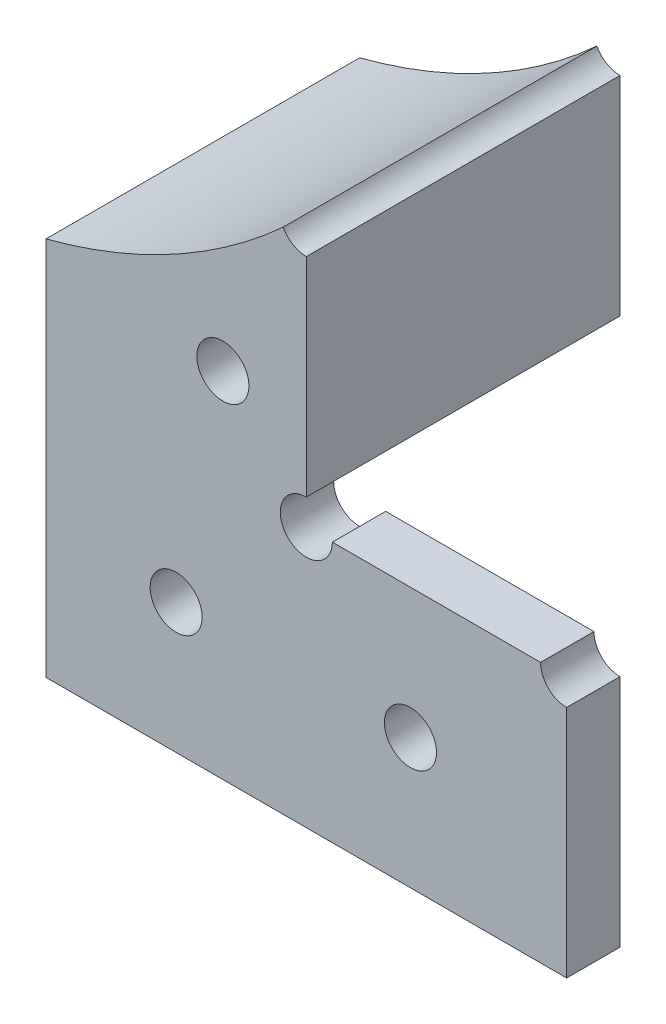
ISO-10303-21;
HEADER;
FILE_DESCRIPTION(('STEP AP214'),'2;1');
FILE_NAME('part.step','',(''),(''),'','','');
FILE_SCHEMA(('AUTOMOTIVE_DESIGN { 1 0 10303 214 1 1 1 1 }'));
ENDSEC;
DATA;
#1=APPLICATION_CONTEXT('core data for automotive mechanical design processes');
#2=APPLICATION_PROTOCOL_DEFINITION('international standard','automotive_design',2000,#1);
#3=PRODUCT_CONTEXT('',#1,'mechanical');
#4=PRODUCT('Part','Part','',(#3));
#5=PRODUCT_RELATED_PRODUCT_CATEGORY('part','',(#4));
#6=PRODUCT_DEFINITION_FORMATION('','',#4);
#7=PRODUCT_DEFINITION_CONTEXT('part definition',#1,'design');
#8=PRODUCT_DEFINITION('design','',#6,#7);
#9=PRODUCT_DEFINITION_SHAPE('','',#8);
#10=(LENGTH_UNIT() NAMED_UNIT(*) SI_UNIT(.MILLI.,.METRE.));
#11=(NAMED_UNIT(*) PLANE_ANGLE_UNIT() SI_UNIT($,.RADIAN.));
#12=(NAMED_UNIT(*) SI_UNIT($,.STERADIAN.) SOLID_ANGLE_UNIT());
#13=UNCERTAINTY_MEASURE_WITH_UNIT(LENGTH_MEASURE(1.E-05),#10,'distance_accuracy_value','');
#14=(GEOMETRIC_REPRESENTATION_CONTEXT(3) GLOBAL_UNCERTAINTY_ASSIGNED_CONTEXT((#13)) GLOBAL_UNIT_ASSIGNED_CONTEXT((#10,
#11,#12)) REPRESENTATION_CONTEXT('',''));
#15=CARTESIAN_POINT('',(0.,0.,0.));
#16=DIRECTION('',(0.,0.,1.));
#17=DIRECTION('',(1.,0.,0.));
#18=AXIS2_PLACEMENT_3D('',#15,#16,#17);
#19=CARTESIAN_POINT('',(10.,-10.,4.1));
#20=DIRECTION('',(-1.,0.,0.));
#21=DIRECTION('',(0.,0.,1.));
#22=AXIS2_PLACEMENT_3D('',#19,#20,#21);
#23=PLANE('',#22);
#24=DIRECTION('',(0.,1.,0.));
#25=VECTOR('',#24,1.);
#26=CARTESIAN_POINT('',(10.,10.,-20.));
#27=LINE('',#26,#25);
#28=CARTESIAN_POINT('',(10.,12.,-20.));
#29=VERTEX_POINT('',#28);
#30=CARTESIAN_POINT('',(10.,28.,-20.));
#31=VERTEX_POINT('',#30);
#32=EDGE_CURVE('E171',#29,#31,#27,.T.);
#33=ORIENTED_EDGE('',*,*,#32,.T.);
#34=DIRECTION('',(0.,0.,1.));
#35=VECTOR('',#34,1.);
#36=CARTESIAN_POINT('',(10.,28.,-20.));
#37=LINE('',#36,#35);
#38=CARTESIAN_POINT('',(10.,28.,4.1));
#39=VERTEX_POINT('',#38);
#40=EDGE_CURVE('E216',#31,#39,#37,.T.);
#41=ORIENTED_EDGE('',*,*,#40,.T.);
#42=DIRECTION('',(0.,1.,0.));
#43=VECTOR('',#42,1.);
#44=CARTESIAN_POINT('',(10.,-10.,4.1));
#45=LINE('',#44,#43);
#46=CARTESIAN_POINT('',(10.,12.,4.1));
#47=VERTEX_POINT('',#46);
#48=EDGE_CURVE('E184',#47,#39,#45,.T.);
#49=ORIENTED_EDGE('',*,*,#48,.F.);
#50=DIRECTION('',(0.,0.,1.));
#51=VECTOR('',#50,1.);
#52=CARTESIAN_POINT('',(10.,12.,-20.));
#53=LINE('',#52,#51);
#54=EDGE_CURVE('E220',#47,#29,#53,.F.);
#55=ORIENTED_EDGE('',*,*,#54,.T.);
#56=EDGE_LOOP('',(#33,#41,#49,#55));
#57=FACE_BOUND('',#56,.T.);
#58=ADVANCED_FACE('F38',(#57),#23,.F.);
#59=CARTESIAN_POINT('',(0.,0.,4.1));
#60=DIRECTION('',(0.,0.,-1.));
#61=DIRECTION('',(-1.,0.,0.));
#62=AXIS2_PLACEMENT_3D('',#59,#60,#61);
#63=PLANE('',#62);
#64=CARTESIAN_POINT('',(18.,0.,4.1));
#65=DIRECTION('',(0.,0.,1.));
#66=DIRECTION('',(1.,0.,0.));
#67=AXIS2_PLACEMENT_3D('',#64,#65,#66);
#68=CIRCLE('',#67,2.);
#69=CARTESIAN_POINT('',(20.,0.,4.1));
#70=VERTEX_POINT('',#69);
#71=EDGE_CURVE('E141',#70,#70,#68,.T.);
#72=ORIENTED_EDGE('',*,*,#71,.F.);
#73=EDGE_LOOP('',(#72));
#74=FACE_BOUND('',#73,.T.);
#75=CARTESIAN_POINT('',(3.58918550368583,17.1783710073717,4.1));
#76=DIRECTION('',(0.,0.,1.));
#77=DIRECTION('',(1.,0.,0.));
#78=AXIS2_PLACEMENT_3D('',#75,#76,#77);
#79=CIRCLE('',#78,2.);
#80=CARTESIAN_POINT('',(5.58918550368583,17.1783710073717,4.1));
#81=VERTEX_POINT('',#80);
#82=EDGE_CURVE('E147',#81,#81,#79,.T.);
#83=ORIENTED_EDGE('',*,*,#82,.F.);
#84=EDGE_LOOP('',(#83));
#85=FACE_BOUND('',#84,.T.);
#86=DIRECTION('',(0.,-1.,0.));
#87=VECTOR('',#86,1.);
#88=CARTESIAN_POINT('',(30.,-10.,4.1));
#89=LINE('',#88,#87);
#90=CARTESIAN_POINT('',(30.,7.99999999999999,4.1));
#91=VERTEX_POINT('',#90);
#92=CARTESIAN_POINT('',(30.,-10.,4.1));
#93=VERTEX_POINT('',#92);
#94=EDGE_CURVE('E139',#91,#93,#89,.T.);
#95=ORIENTED_EDGE('',*,*,#94,.F.);
#96=CARTESIAN_POINT('',(30.,10.,4.1));
#97=DIRECTION('',(0.,0.,1.));
#98=DIRECTION('',(1.,0.,0.));
#99=AXIS2_PLACEMENT_3D('',#96,#97,#98);
#100=CIRCLE('',#99,2.);
#101=CARTESIAN_POINT('',(28.,10.,4.1));
#102=VERTEX_POINT('',#101);
#103=EDGE_CURVE('E122',#102,#91,#100,.T.);
#104=ORIENTED_EDGE('',*,*,#103,.F.);
#105=DIRECTION('',(-1.,0.,0.));
#106=VECTOR('',#105,1.);
#107=CARTESIAN_POINT('',(30.,10.,4.1));
#108=LINE('',#107,#106);
#109=CARTESIAN_POINT('',(12.,10.,4.1));
#110=VERTEX_POINT('',#109);
#111=EDGE_CURVE('E137',#102,#110,#108,.T.);
#112=ORIENTED_EDGE('',*,*,#111,.T.);
#113=CARTESIAN_POINT('',(10.,10.,4.1));
#114=DIRECTION('',(0.,0.,1.));
#115=DIRECTION('',(1.,0.,0.));
#116=AXIS2_PLACEMENT_3D('',#113,#114,#115);
#117=CIRCLE('',#116,2.);
#118=EDGE_CURVE('E60',#47,#110,#117,.T.);
#119=ORIENTED_EDGE('',*,*,#118,.F.);
#120=ORIENTED_EDGE('',*,*,#48,.T.);
#121=CARTESIAN_POINT('',(10.,30.,4.1));
#122=DIRECTION('',(0.,0.,1.));
#123=DIRECTION('',(1.,0.,0.));
#124=AXIS2_PLACEMENT_3D('',#121,#122,#123);
#125=CIRCLE('',#124,2.);
#126=CARTESIAN_POINT('',(8.22660282573047,29.0753041244318,4.1));
#127=VERTEX_POINT('',#126);
#128=EDGE_CURVE('E140',#127,#39,#125,.T.);
#129=ORIENTED_EDGE('',*,*,#128,.F.);
#130=CARTESIAN_POINT('',(-20.8,60.8,4.1));
#131=DIRECTION('',(0.,0.,1.));
#132=DIRECTION('',(-1.,0.,0.));
#133=AXIS2_PLACEMENT_3D('',#130,#131,#132);
#134=CIRCLE('',#133,43.);
#135=CARTESIAN_POINT('',(-10.,19.1783710073717,4.1));
#136=VERTEX_POINT('',#135);
#137=EDGE_CURVE('E156',#136,#127,#134,.T.);
#138=ORIENTED_EDGE('',*,*,#137,.F.);
#139=DIRECTION('',(0.,-1.,0.));
#140=VECTOR('',#139,1.);
#141=CARTESIAN_POINT('',(-10.,-10.,4.1));
#142=LINE('',#141,#140);
#143=CARTESIAN_POINT('',(-10.,-10.,4.1));
#144=VERTEX_POINT('',#143);
#145=EDGE_CURVE('E187',#136,#144,#142,.T.);
#146=ORIENTED_EDGE('',*,*,#145,.T.);
#147=DIRECTION('',(1.,0.,0.));
#148=VECTOR('',#147,1.);
#149=CARTESIAN_POINT('',(-10.,-10.,4.1));
#150=LINE('',#149,#148);
#151=EDGE_CURVE('E190',#144,#93,#150,.T.);
#152=ORIENTED_EDGE('',*,*,#151,.T.);
#153=EDGE_LOOP('',(#95,#104,#112,#119,#120,#129,#138,#146,#152));
#154=FACE_BOUND('',#153,.T.);
#155=CARTESIAN_POINT('',(0.,0.,4.1));
#156=DIRECTION('',(0.,0.,1.));
#157=DIRECTION('',(1.,0.,0.));
#158=AXIS2_PLACEMENT_3D('',#155,#156,#157);
#159=CIRCLE('',#158,2.);
#160=CARTESIAN_POINT('',(2.,0.,4.1));
#161=VERTEX_POINT('',#160);
#162=EDGE_CURVE('E178',#161,#161,#159,.T.);
#163=ORIENTED_EDGE('',*,*,#162,.F.);
#164=EDGE_LOOP('',(#163));
#165=FACE_BOUND('',#164,.T.);
#166=ADVANCED_FACE('F135',(#74,#85,#154,#165),#63,.F.);
#167=CARTESIAN_POINT('',(0.,0.,0.));
#168=DIRECTION('',(0.,0.,-1.));
#169=DIRECTION('',(-1.,0.,0.));
#170=AXIS2_PLACEMENT_3D('',#167,#168,#169);
#171=PLANE('',#170);
#172=CARTESIAN_POINT('',(18.,0.,0.));
#173=DIRECTION('',(0.,0.,-1.));
#174=DIRECTION('',(-1.,0.,0.));
#175=AXIS2_PLACEMENT_3D('',#172,#173,#174);
#176=CIRCLE('',#175,2.);
#177=CARTESIAN_POINT('',(16.,0.,0.));
#178=VERTEX_POINT('',#177);
#179=EDGE_CURVE('E41',#178,#178,#176,.T.);
#180=ORIENTED_EDGE('',*,*,#179,.F.);
#181=EDGE_LOOP('',(#180));
#182=FACE_BOUND('',#181,.T.);
#183=CARTESIAN_POINT('',(30.,10.,0.));
#184=DIRECTION('',(0.,0.,-1.));
#185=DIRECTION('',(-1.,0.,0.));
#186=AXIS2_PLACEMENT_3D('',#183,#184,#185);
#187=CIRCLE('',#186,2.);
#188=CARTESIAN_POINT('',(30.,8.,0.));
#189=VERTEX_POINT('',#188);
#190=CARTESIAN_POINT('',(28.,10.,0.));
#191=VERTEX_POINT('',#190);
#192=EDGE_CURVE('E125',#189,#191,#187,.T.);
#193=ORIENTED_EDGE('',*,*,#192,.F.);
#194=DIRECTION('',(0.,1.,0.));
#195=VECTOR('',#194,1.);
#196=CARTESIAN_POINT('',(30.,-10.,0.));
#197=LINE('',#196,#195);
#198=CARTESIAN_POINT('',(30.,-10.,0.));
#199=VERTEX_POINT('',#198);
#200=EDGE_CURVE('E208',#199,#189,#197,.T.);
#201=ORIENTED_EDGE('',*,*,#200,.F.);
#202=DIRECTION('',(1.,0.,0.));
#203=VECTOR('',#202,1.);
#204=CARTESIAN_POINT('',(-10.,-10.,0.));
#205=LINE('',#204,#203);
#206=CARTESIAN_POINT('',(-10.,-10.,0.));
#207=VERTEX_POINT('',#206);
#208=EDGE_CURVE('E188',#207,#199,#205,.T.);
#209=ORIENTED_EDGE('',*,*,#208,.F.);
#210=DIRECTION('',(0.,-1.,0.));
#211=VECTOR('',#210,1.);
#212=CARTESIAN_POINT('',(-10.,-10.,0.));
#213=LINE('',#212,#211);
#214=CARTESIAN_POINT('',(-10.,10.,0.));
#215=VERTEX_POINT('',#214);
#216=EDGE_CURVE('E194',#215,#207,#213,.T.);
#217=ORIENTED_EDGE('',*,*,#216,.F.);
#218=DIRECTION('',(-1.,0.,0.));
#219=VECTOR('',#218,1.);
#220=CARTESIAN_POINT('',(-10.,10.,0.));
#221=LINE('',#220,#219);
#222=CARTESIAN_POINT('',(8.,10.,0.));
#223=VERTEX_POINT('',#222);
#224=EDGE_CURVE('E181',#223,#215,#221,.T.);
#225=ORIENTED_EDGE('',*,*,#224,.F.);
#226=CARTESIAN_POINT('',(10.,10.,0.));
#227=DIRECTION('',(0.,0.,-1.));
#228=DIRECTION('',(-1.,0.,0.));
#229=AXIS2_PLACEMENT_3D('',#226,#227,#228);
#230=CIRCLE('',#229,2.);
#231=CARTESIAN_POINT('',(12.,10.,0.));
#232=VERTEX_POINT('',#231);
#233=EDGE_CURVE('E130',#232,#223,#230,.T.);
#234=ORIENTED_EDGE('',*,*,#233,.F.);
#235=DIRECTION('',(-1.,0.,0.));
#236=VECTOR('',#235,1.);
#237=CARTESIAN_POINT('',(30.,10.,0.));
#238=LINE('',#237,#236);
#239=EDGE_CURVE('E144',#191,#232,#238,.T.);
#240=ORIENTED_EDGE('',*,*,#239,.F.);
#241=EDGE_LOOP('',(#193,#201,#209,#217,#225,#234,#240));
#242=FACE_BOUND('',#241,.T.);
#243=CARTESIAN_POINT('',(0.,0.,0.));
#244=DIRECTION('',(0.,0.,1.));
#245=DIRECTION('',(1.,0.,0.));
#246=AXIS2_PLACEMENT_3D('',#243,#244,#245);
#247=CIRCLE('',#246,2.);
#248=CARTESIAN_POINT('',(2.,0.,0.));
#249=VERTEX_POINT('',#248);
#250=EDGE_CURVE('E177',#249,#249,#247,.T.);
#251=ORIENTED_EDGE('',*,*,#250,.T.);
#252=EDGE_LOOP('',(#251));
#253=FACE_BOUND('',#252,.T.);
#254=ADVANCED_FACE('F205',(#182,#242,#253),#171,.T.);
#255=CARTESIAN_POINT('',(-10.,-10.,4.1));
#256=DIRECTION('',(1.,0.,0.));
#257=DIRECTION('',(0.,0.,-1.));
#258=AXIS2_PLACEMENT_3D('',#255,#256,#257);
#259=PLANE('',#258);
#260=ORIENTED_EDGE('',*,*,#145,.F.);
#261=DIRECTION('',(0.,0.,1.));
#262=VECTOR('',#261,1.);
#263=CARTESIAN_POINT('',(-10.,19.1783710073717,-20.));
#264=LINE('',#263,#262);
#265=CARTESIAN_POINT('',(-10.,19.1783710073717,-20.));
#266=VERTEX_POINT('',#265);
#267=EDGE_CURVE('E162',#266,#136,#264,.T.);
#268=ORIENTED_EDGE('',*,*,#267,.F.);
#269=DIRECTION('',(0.,-1.,0.));
#270=VECTOR('',#269,1.);
#271=CARTESIAN_POINT('',(-10.,10.,-20.));
#272=LINE('',#271,#270);
#273=CARTESIAN_POINT('',(-10.,10.,-20.));
#274=VERTEX_POINT('',#273);
#275=EDGE_CURVE('E166',#266,#274,#272,.T.);
#276=ORIENTED_EDGE('',*,*,#275,.T.);
#277=DIRECTION('',(0.,0.,1.));
#278=VECTOR('',#277,1.);
#279=CARTESIAN_POINT('',(-10.,10.,-20.));
#280=LINE('',#279,#278);
#281=EDGE_CURVE('E174',#274,#215,#280,.T.);
#282=ORIENTED_EDGE('',*,*,#281,.T.);
#283=ORIENTED_EDGE('',*,*,#216,.T.);
#284=DIRECTION('',(0.,0.,-1.));
#285=VECTOR('',#284,1.);
#286=CARTESIAN_POINT('',(-10.,-10.,4.1));
#287=LINE('',#286,#285);
#288=EDGE_CURVE('E192',#144,#207,#287,.T.);
#289=ORIENTED_EDGE('',*,*,#288,.F.);
#290=EDGE_LOOP('',(#260,#268,#276,#282,#283,#289));
#291=FACE_BOUND('',#290,.T.);
#292=ADVANCED_FACE('F247',(#291),#259,.F.);
#293=CARTESIAN_POINT('',(-10.,-10.,4.1));
#294=DIRECTION('',(0.,1.,0.));
#295=DIRECTION('',(0.,0.,1.));
#296=AXIS2_PLACEMENT_3D('',#293,#294,#295);
#297=PLANE('',#296);
#298=ORIENTED_EDGE('',*,*,#208,.T.);
#299=DIRECTION('',(0.,0.,-1.));
#300=VECTOR('',#299,1.);
#301=CARTESIAN_POINT('',(30.,-10.,0.));
#302=LINE('',#301,#300);
#303=EDGE_CURVE('E145',#93,#199,#302,.T.);
#304=ORIENTED_EDGE('',*,*,#303,.F.);
#305=ORIENTED_EDGE('',*,*,#151,.F.);
#306=ORIENTED_EDGE('',*,*,#288,.T.);
#307=EDGE_LOOP('',(#298,#304,#305,#306));
#308=FACE_BOUND('',#307,.T.);
#309=ADVANCED_FACE('F258',(#308),#297,.F.);
#310=CARTESIAN_POINT('',(0.,0.,4.1));
#311=DIRECTION('',(0.,0.,-1.));
#312=DIRECTION('',(-1.,0.,0.));
#313=AXIS2_PLACEMENT_3D('',#310,#311,#312);
#314=CYLINDRICAL_SURFACE('',#313,2.);
#315=ORIENTED_EDGE('',*,*,#162,.T.);
#316=EDGE_LOOP('',(#315));
#317=FACE_BOUND('',#316,.T.);
#318=ORIENTED_EDGE('',*,*,#250,.F.);
#319=EDGE_LOOP('',(#318));
#320=FACE_BOUND('',#319,.T.);
#321=ADVANCED_FACE('F260',(#317,#320),#314,.F.);
#322=CARTESIAN_POINT('',(-10.,10.,-20.));
#323=DIRECTION('',(0.,-1.,0.));
#324=DIRECTION('',(0.,0.,-1.));
#325=AXIS2_PLACEMENT_3D('',#322,#323,#324);
#326=PLANE('',#325);
#327=DIRECTION('',(0.,0.,1.));
#328=VECTOR('',#327,1.);
#329=CARTESIAN_POINT('',(8.,10.,-20.));
#330=LINE('',#329,#328);
#331=CARTESIAN_POINT('',(8.,10.,-20.));
#332=VERTEX_POINT('',#331);
#333=EDGE_CURVE('E223',#223,#332,#330,.F.);
#334=ORIENTED_EDGE('',*,*,#333,.F.);
#335=ORIENTED_EDGE('',*,*,#224,.T.);
#336=ORIENTED_EDGE('',*,*,#281,.F.);
#337=DIRECTION('',(1.,0.,0.));
#338=VECTOR('',#337,1.);
#339=CARTESIAN_POINT('',(-10.,10.,-20.));
#340=LINE('',#339,#338);
#341=EDGE_CURVE('E168',#274,#332,#340,.T.);
#342=ORIENTED_EDGE('',*,*,#341,.T.);
#343=EDGE_LOOP('',(#334,#335,#336,#342));
#344=FACE_BOUND('',#343,.T.);
#345=ADVANCED_FACE('F253',(#344),#326,.T.);
#346=CARTESIAN_POINT('',(0.,0.,-20.));
#347=DIRECTION('',(0.,0.,-1.));
#348=DIRECTION('',(-1.,0.,0.));
#349=AXIS2_PLACEMENT_3D('',#346,#347,#348);
#350=PLANE('',#349);
#351=CARTESIAN_POINT('',(10.,30.,-20.));
#352=DIRECTION('',(0.,0.,1.));
#353=DIRECTION('',(1.,0.,0.));
#354=AXIS2_PLACEMENT_3D('',#351,#352,#353);
#355=CIRCLE('',#354,2.);
#356=CARTESIAN_POINT('',(8.22660282573047,29.0753041244318,-20.));
#357=VERTEX_POINT('',#356);
#358=EDGE_CURVE('E53',#357,#31,#355,.T.);
#359=ORIENTED_EDGE('',*,*,#358,.T.);
#360=ORIENTED_EDGE('',*,*,#32,.F.);
#361=CARTESIAN_POINT('',(10.,10.,-20.));
#362=DIRECTION('',(0.,0.,1.));
#363=DIRECTION('',(1.,0.,0.));
#364=AXIS2_PLACEMENT_3D('',#361,#362,#363);
#365=CIRCLE('',#364,2.);
#366=EDGE_CURVE('E210',#29,#332,#365,.T.);
#367=ORIENTED_EDGE('',*,*,#366,.T.);
#368=ORIENTED_EDGE('',*,*,#341,.F.);
#369=ORIENTED_EDGE('',*,*,#275,.F.);
#370=CARTESIAN_POINT('',(-20.8,60.8,-20.));
#371=DIRECTION('',(0.,0.,1.));
#372=DIRECTION('',(-1.,0.,0.));
#373=AXIS2_PLACEMENT_3D('',#370,#371,#372);
#374=CIRCLE('',#373,43.);
#375=EDGE_CURVE('E159',#266,#357,#374,.T.);
#376=ORIENTED_EDGE('',*,*,#375,.T.);
#377=EDGE_LOOP('',(#359,#360,#367,#368,#369,#376));
#378=FACE_BOUND('',#377,.T.);
#379=CARTESIAN_POINT('',(3.58918550368583,17.1783710073717,-20.));
#380=DIRECTION('',(0.,0.,1.));
#381=DIRECTION('',(1.,0.,0.));
#382=AXIS2_PLACEMENT_3D('',#379,#380,#381);
#383=CIRCLE('',#382,2.);
#384=CARTESIAN_POINT('',(5.58918550368583,17.1783710073717,-20.));
#385=VERTEX_POINT('',#384);
#386=EDGE_CURVE('E153',#385,#385,#383,.T.);
#387=ORIENTED_EDGE('',*,*,#386,.T.);
#388=EDGE_LOOP('',(#387));
#389=FACE_BOUND('',#388,.T.);
#390=ADVANCED_FACE('F234',(#378,#389),#350,.T.);
#391=CARTESIAN_POINT('',(-20.8,60.8,-20.));
#392=DIRECTION('',(0.,0.,1.));
#393=DIRECTION('',(1.,0.,0.));
#394=AXIS2_PLACEMENT_3D('',#391,#392,#393);
#395=CYLINDRICAL_SURFACE('',#394,43.);
#396=ORIENTED_EDGE('',*,*,#137,.T.);
#397=DIRECTION('',(0.,0.,1.));
#398=VECTOR('',#397,1.);
#399=CARTESIAN_POINT('',(8.22660282573047,29.0753041244318,-7.95));
#400=LINE('',#399,#398);
#401=EDGE_CURVE('E11',#127,#357,#400,.F.);
#402=ORIENTED_EDGE('',*,*,#401,.T.);
#403=ORIENTED_EDGE('',*,*,#375,.F.);
#404=ORIENTED_EDGE('',*,*,#267,.T.);
#405=EDGE_LOOP('',(#396,#402,#403,#404));
#406=FACE_BOUND('',#405,.T.);
#407=ADVANCED_FACE('F244',(#406),#395,.F.);
#408=CARTESIAN_POINT('',(3.58918550368583,17.1783710073717,-20.));
#409=DIRECTION('',(0.,0.,1.));
#410=DIRECTION('',(1.,0.,0.));
#411=AXIS2_PLACEMENT_3D('',#408,#409,#410);
#412=CYLINDRICAL_SURFACE('',#411,2.);
#413=ORIENTED_EDGE('',*,*,#386,.F.);
#414=EDGE_LOOP('',(#413));
#415=FACE_BOUND('',#414,.T.);
#416=ORIENTED_EDGE('',*,*,#82,.T.);
#417=EDGE_LOOP('',(#416));
#418=FACE_BOUND('',#417,.T.);
#419=ADVANCED_FACE('F288',(#415,#418),#412,.F.);
#420=CARTESIAN_POINT('',(30.,10.,0.));
#421=DIRECTION('',(0.,-1.,0.));
#422=DIRECTION('',(0.,0.,-1.));
#423=AXIS2_PLACEMENT_3D('',#420,#421,#422);
#424=PLANE('',#423);
#425=ORIENTED_EDGE('',*,*,#111,.F.);
#426=DIRECTION('',(0.,0.,1.));
#427=VECTOR('',#426,1.);
#428=CARTESIAN_POINT('',(28.,10.,-20.));
#429=LINE('',#428,#427);
#430=EDGE_CURVE('E119',#102,#191,#429,.F.);
#431=ORIENTED_EDGE('',*,*,#430,.T.);
#432=ORIENTED_EDGE('',*,*,#239,.T.);
#433=DIRECTION('',(0.,0.,1.));
#434=VECTOR('',#433,1.);
#435=CARTESIAN_POINT('',(12.,10.,-20.));
#436=LINE('',#435,#434);
#437=EDGE_CURVE('E46',#232,#110,#436,.T.);
#438=ORIENTED_EDGE('',*,*,#437,.T.);
#439=EDGE_LOOP('',(#425,#431,#432,#438));
#440=FACE_BOUND('',#439,.T.);
#441=ADVANCED_FACE('F143',(#440),#424,.F.);
#442=CARTESIAN_POINT('',(30.,0.,0.));
#443=DIRECTION('',(1.,0.,0.));
#444=DIRECTION('',(0.,0.,-1.));
#445=AXIS2_PLACEMENT_3D('',#442,#443,#444);
#446=PLANE('',#445);
#447=DIRECTION('',(0.,0.,1.));
#448=VECTOR('',#447,1.);
#449=CARTESIAN_POINT('',(30.,8.,-20.));
#450=LINE('',#449,#448);
#451=EDGE_CURVE('E199',#91,#189,#450,.F.);
#452=ORIENTED_EDGE('',*,*,#451,.F.);
#453=ORIENTED_EDGE('',*,*,#94,.T.);
#454=ORIENTED_EDGE('',*,*,#303,.T.);
#455=ORIENTED_EDGE('',*,*,#200,.T.);
#456=EDGE_LOOP('',(#452,#453,#454,#455));
#457=FACE_BOUND('',#456,.T.);
#458=ADVANCED_FACE('F212',(#457),#446,.T.);
#459=CARTESIAN_POINT('',(30.,10.,-20.));
#460=DIRECTION('',(0.,0.,1.));
#461=DIRECTION('',(1.,0.,0.));
#462=AXIS2_PLACEMENT_3D('',#459,#460,#461);
#463=CYLINDRICAL_SURFACE('',#462,2.);
#464=ORIENTED_EDGE('',*,*,#103,.T.);
#465=ORIENTED_EDGE('',*,*,#451,.T.);
#466=ORIENTED_EDGE('',*,*,#192,.T.);
#467=ORIENTED_EDGE('',*,*,#430,.F.);
#468=EDGE_LOOP('',(#464,#465,#466,#467));
#469=FACE_BOUND('',#468,.T.);
#470=ADVANCED_FACE('F121',(#469),#463,.F.);
#471=CARTESIAN_POINT('',(10.,10.,-20.));
#472=DIRECTION('',(0.,0.,1.));
#473=DIRECTION('',(1.,0.,0.));
#474=AXIS2_PLACEMENT_3D('',#471,#472,#473);
#475=CYLINDRICAL_SURFACE('',#474,2.);
#476=ORIENTED_EDGE('',*,*,#118,.T.);
#477=ORIENTED_EDGE('',*,*,#437,.F.);
#478=ORIENTED_EDGE('',*,*,#233,.T.);
#479=ORIENTED_EDGE('',*,*,#333,.T.);
#480=ORIENTED_EDGE('',*,*,#366,.F.);
#481=ORIENTED_EDGE('',*,*,#54,.F.);
#482=EDGE_LOOP('',(#476,#477,#478,#479,#480,#481));
#483=FACE_BOUND('',#482,.T.);
#484=ADVANCED_FACE('F239',(#483),#475,.F.);
#485=CARTESIAN_POINT('',(10.,30.,-20.));
#486=DIRECTION('',(0.,0.,1.));
#487=DIRECTION('',(1.,0.,0.));
#488=AXIS2_PLACEMENT_3D('',#485,#486,#487);
#489=CYLINDRICAL_SURFACE('',#488,2.);
#490=ORIENTED_EDGE('',*,*,#358,.F.);
#491=ORIENTED_EDGE('',*,*,#401,.F.);
#492=ORIENTED_EDGE('',*,*,#128,.T.);
#493=ORIENTED_EDGE('',*,*,#40,.F.);
#494=EDGE_LOOP('',(#490,#491,#492,#493));
#495=FACE_BOUND('',#494,.T.);
#496=ADVANCED_FACE('F298',(#495),#489,.F.);
#497=CARTESIAN_POINT('',(18.,0.,-20.));
#498=DIRECTION('',(0.,0.,1.));
#499=DIRECTION('',(1.,0.,0.));
#500=AXIS2_PLACEMENT_3D('',#497,#498,#499);
#501=CYLINDRICAL_SURFACE('',#500,2.);
#502=ORIENTED_EDGE('',*,*,#179,.T.);
#503=EDGE_LOOP('',(#502));
#504=FACE_BOUND('',#503,.T.);
#505=ORIENTED_EDGE('',*,*,#71,.T.);
#506=EDGE_LOOP('',(#505));
#507=FACE_BOUND('',#506,.T.);
#508=ADVANCED_FACE('F299',(#504,#507),#501,.F.);
#509=CLOSED_SHELL('',(#58,#166,#254,#292,#309,#321,#345,#390,#407,#419,#441,#458,#470,#484,#496,#508));
#510=MANIFOLD_SOLID_BREP('B2',#509);
#511=ADVANCED_BREP_SHAPE_REPRESENTATION('',(#18,#510),#14);
#512=SHAPE_DEFINITION_REPRESENTATION(#9,#511);
ENDSEC;
END-ISO-10303-21;
